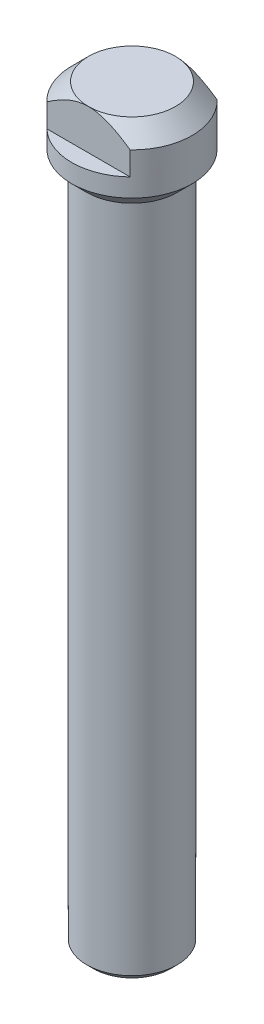
ISO-10303-21;
HEADER;
FILE_DESCRIPTION(('STEP AP214'),'2;1');
FILE_NAME('part.step','',(''),(''),'','','');
FILE_SCHEMA(('AUTOMOTIVE_DESIGN { 1 0 10303 214 1 1 1 1 }'));
ENDSEC;
DATA;
#1=APPLICATION_CONTEXT('core data for automotive mechanical design processes');
#2=APPLICATION_PROTOCOL_DEFINITION('international standard','automotive_design',2000,#1);
#3=PRODUCT_CONTEXT('',#1,'mechanical');
#4=PRODUCT('Part','Part','',(#3));
#5=PRODUCT_RELATED_PRODUCT_CATEGORY('part','',(#4));
#6=PRODUCT_DEFINITION_FORMATION('','',#4);
#7=PRODUCT_DEFINITION_CONTEXT('part definition',#1,'design');
#8=PRODUCT_DEFINITION('design','',#6,#7);
#9=PRODUCT_DEFINITION_SHAPE('','',#8);
#10=(LENGTH_UNIT() NAMED_UNIT(*) SI_UNIT(.MILLI.,.METRE.));
#11=(NAMED_UNIT(*) PLANE_ANGLE_UNIT() SI_UNIT($,.RADIAN.));
#12=(NAMED_UNIT(*) SI_UNIT($,.STERADIAN.) SOLID_ANGLE_UNIT());
#13=UNCERTAINTY_MEASURE_WITH_UNIT(LENGTH_MEASURE(1.E-05),#10,'distance_accuracy_value','');
#14=(GEOMETRIC_REPRESENTATION_CONTEXT(3) GLOBAL_UNCERTAINTY_ASSIGNED_CONTEXT((#13)) GLOBAL_UNIT_ASSIGNED_CONTEXT((#10,
#11,#12)) REPRESENTATION_CONTEXT('',''));
#15=CARTESIAN_POINT('',(0.,0.,0.));
#16=DIRECTION('',(0.,0.,1.));
#17=DIRECTION('',(1.,0.,0.));
#18=AXIS2_PLACEMENT_3D('',#15,#16,#17);
#19=CARTESIAN_POINT('',(0.,-224.,0.));
#20=DIRECTION('',(0.,1.,0.));
#21=DIRECTION('',(0.,0.,1.));
#22=AXIS2_PLACEMENT_3D('',#19,#20,#21);
#23=CYLINDRICAL_SURFACE('',#22,13.5);
#24=CARTESIAN_POINT('',(0.,-221.999999999999,0.));
#25=DIRECTION('',(0.,-1.,0.));
#26=DIRECTION('',(0.,0.,-1.));
#27=AXIS2_PLACEMENT_3D('',#24,#25,#26);
#28=CIRCLE('',#27,13.5);
#29=CARTESIAN_POINT('',(0.,-221.999999999999,-13.5));
#30=VERTEX_POINT('',#29);
#31=EDGE_CURVE('E41',#30,#30,#28,.F.);
#32=ORIENTED_EDGE('',*,*,#31,.T.);
#33=EDGE_LOOP('',(#32));
#34=FACE_BOUND('',#33,.T.);
#35=CARTESIAN_POINT('',(0.,-22.,0.));
#36=DIRECTION('',(0.,1.,0.));
#37=DIRECTION('',(0.,0.,1.));
#38=AXIS2_PLACEMENT_3D('',#35,#36,#37);
#39=CIRCLE('',#38,13.5);
#40=CARTESIAN_POINT('',(0.,-22.,13.5));
#41=VERTEX_POINT('',#40);
#42=EDGE_CURVE('E104',#41,#41,#39,.T.);
#43=ORIENTED_EDGE('',*,*,#42,.F.);
#44=EDGE_LOOP('',(#43));
#45=FACE_BOUND('',#44,.T.);
#46=ADVANCED_FACE('F33',(#34,#45),#23,.T.);
#47=CARTESIAN_POINT('',(13.5,-224.,0.));
#48=DIRECTION('',(0.,-1.,0.));
#49=DIRECTION('',(0.,0.,-1.));
#50=AXIS2_PLACEMENT_3D('',#47,#48,#49);
#51=PLANE('',#50);
#52=CARTESIAN_POINT('',(0.,-224.,0.));
#53=DIRECTION('',(0.,-1.,0.));
#54=DIRECTION('',(0.,0.,-1.));
#55=AXIS2_PLACEMENT_3D('',#52,#53,#54);
#56=CIRCLE('',#55,11.4999999999988);
#57=CARTESIAN_POINT('',(0.,-224.,-11.4999999999988));
#58=VERTEX_POINT('',#57);
#59=EDGE_CURVE('E11',#58,#58,#56,.T.);
#60=ORIENTED_EDGE('',*,*,#59,.T.);
#61=EDGE_LOOP('',(#60));
#62=FACE_BOUND('',#61,.T.);
#63=ADVANCED_FACE('F151',(#62),#51,.T.);
#64=CARTESIAN_POINT('',(0.,0.,0.));
#65=DIRECTION('',(0.,1.,0.));
#66=DIRECTION('',(0.,0.,1.));
#67=AXIS2_PLACEMENT_3D('',#64,#65,#66);
#68=PLANE('',#67);
#69=CARTESIAN_POINT('',(0.,0.,0.));
#70=DIRECTION('',(0.,1.,0.));
#71=DIRECTION('',(0.,0.,1.));
#72=AXIS2_PLACEMENT_3D('',#69,#70,#71);
#73=CIRCLE('',#72,13.);
#74=CARTESIAN_POINT('',(0.,0.,13.));
#75=VERTEX_POINT('',#74);
#76=CARTESIAN_POINT('',(0.,0.,-13.));
#77=VERTEX_POINT('',#76);
#78=EDGE_CURVE('E112',#75,#77,#73,.T.);
#79=ORIENTED_EDGE('',*,*,#78,.T.);
#80=CARTESIAN_POINT('',(0.,0.,0.));
#81=DIRECTION('',(0.,1.,0.));
#82=DIRECTION('',(0.,0.,1.));
#83=AXIS2_PLACEMENT_3D('',#80,#81,#82);
#84=CIRCLE('',#83,13.);
#85=EDGE_CURVE('E115',#77,#75,#84,.T.);
#86=ORIENTED_EDGE('',*,*,#85,.T.);
#87=EDGE_LOOP('',(#79,#86));
#88=FACE_BOUND('',#87,.T.);
#89=ADVANCED_FACE('F148',(#88),#68,.T.);
#90=CARTESIAN_POINT('',(0.,-224.,0.));
#91=DIRECTION('',(0.,1.,0.));
#92=DIRECTION('',(0.,0.,1.));
#93=AXIS2_PLACEMENT_3D('',#90,#91,#92);
#94=CYLINDRICAL_SURFACE('',#93,18.);
#95=DIRECTION('',(0.,1.,0.));
#96=VECTOR('',#95,1.);
#97=CARTESIAN_POINT('',(-12.4498995979887,-12.,13.));
#98=LINE('',#97,#96);
#99=CARTESIAN_POINT('',(-12.4498995979887,-12.,13.));
#100=VERTEX_POINT('',#99);
#101=CARTESIAN_POINT('',(-12.4498995979887,-5.00000000000003,13.));
#102=VERTEX_POINT('',#101);
#103=EDGE_CURVE('E102',#100,#102,#98,.T.);
#104=ORIENTED_EDGE('',*,*,#103,.T.);
#105=CARTESIAN_POINT('',(0.,-5.00000000000003,0.));
#106=DIRECTION('',(0.,1.,0.));
#107=DIRECTION('',(0.,0.,1.));
#108=AXIS2_PLACEMENT_3D('',#105,#106,#107);
#109=CIRCLE('',#108,18.);
#110=CARTESIAN_POINT('',(-12.4498995979887,-5.00000000000003,-13.));
#111=VERTEX_POINT('',#110);
#112=EDGE_CURVE('E48',#102,#111,#109,.F.);
#113=ORIENTED_EDGE('',*,*,#112,.T.);
#114=DIRECTION('',(0.,1.,0.));
#115=VECTOR('',#114,1.);
#116=CARTESIAN_POINT('',(-12.4498995979887,-12.,-13.));
#117=LINE('',#116,#115);
#118=CARTESIAN_POINT('',(-12.4498995979887,-12.,-13.));
#119=VERTEX_POINT('',#118);
#120=EDGE_CURVE('E88',#119,#111,#117,.T.);
#121=ORIENTED_EDGE('',*,*,#120,.F.);
#122=CARTESIAN_POINT('',(0.,-12.,0.));
#123=DIRECTION('',(0.,1.,0.));
#124=DIRECTION('',(0.,0.,1.));
#125=AXIS2_PLACEMENT_3D('',#122,#123,#124);
#126=CIRCLE('',#125,18.);
#127=CARTESIAN_POINT('',(12.4498995979887,-12.,-13.));
#128=VERTEX_POINT('',#127);
#129=EDGE_CURVE('E82',#128,#119,#126,.T.);
#130=ORIENTED_EDGE('',*,*,#129,.F.);
#131=DIRECTION('',(0.,1.,0.));
#132=VECTOR('',#131,1.);
#133=CARTESIAN_POINT('',(12.4498995979887,-12.,-13.));
#134=LINE('',#133,#132);
#135=CARTESIAN_POINT('',(12.4498995979887,-5.00000000000003,-13.));
#136=VERTEX_POINT('',#135);
#137=EDGE_CURVE('E90',#128,#136,#134,.T.);
#138=ORIENTED_EDGE('',*,*,#137,.T.);
#139=CARTESIAN_POINT('',(0.,-5.00000000000003,0.));
#140=DIRECTION('',(0.,1.,0.));
#141=DIRECTION('',(0.,0.,1.));
#142=AXIS2_PLACEMENT_3D('',#139,#140,#141);
#143=CIRCLE('',#142,18.);
#144=CARTESIAN_POINT('',(12.4498995979887,-5.00000000000003,13.));
#145=VERTEX_POINT('',#144);
#146=EDGE_CURVE('E262',#136,#145,#143,.F.);
#147=ORIENTED_EDGE('',*,*,#146,.T.);
#148=DIRECTION('',(0.,1.,0.));
#149=VECTOR('',#148,1.);
#150=CARTESIAN_POINT('',(12.4498995979887,-12.,13.));
#151=LINE('',#150,#149);
#152=CARTESIAN_POINT('',(12.4498995979887,-12.,13.));
#153=VERTEX_POINT('',#152);
#154=EDGE_CURVE('E101',#153,#145,#151,.T.);
#155=ORIENTED_EDGE('',*,*,#154,.F.);
#156=CARTESIAN_POINT('',(0.,-12.,0.));
#157=DIRECTION('',(0.,1.,0.));
#158=DIRECTION('',(0.,0.,1.));
#159=AXIS2_PLACEMENT_3D('',#156,#157,#158);
#160=CIRCLE('',#159,18.);
#161=EDGE_CURVE('E95',#100,#153,#160,.T.);
#162=ORIENTED_EDGE('',*,*,#161,.F.);
#163=EDGE_LOOP('',(#104,#113,#121,#130,#138,#147,#155,#162));
#164=FACE_BOUND('',#163,.T.);
#165=CARTESIAN_POINT('',(0.,-17.5,0.));
#166=DIRECTION('',(0.,1.,0.));
#167=DIRECTION('',(0.,0.,1.));
#168=AXIS2_PLACEMENT_3D('',#165,#166,#167);
#169=CIRCLE('',#168,18.);
#170=CARTESIAN_POINT('',(0.,-17.5,18.));
#171=VERTEX_POINT('',#170);
#172=EDGE_CURVE('E109',#171,#171,#169,.T.);
#173=ORIENTED_EDGE('',*,*,#172,.T.);
#174=EDGE_LOOP('',(#173));
#175=FACE_BOUND('',#174,.T.);
#176=ADVANCED_FACE('F92',(#164,#175),#94,.T.);
#177=CARTESIAN_POINT('',(0.,-17.5,0.));
#178=DIRECTION('',(0.,1.,0.));
#179=DIRECTION('',(0.,0.,1.));
#180=AXIS2_PLACEMENT_3D('',#177,#178,#179);
#181=CONICAL_SURFACE('',#180,18.,0.785398163397448);
#182=ORIENTED_EDGE('',*,*,#42,.T.);
#183=EDGE_LOOP('',(#182));
#184=FACE_BOUND('',#183,.T.);
#185=ORIENTED_EDGE('',*,*,#172,.F.);
#186=EDGE_LOOP('',(#185));
#187=FACE_BOUND('',#186,.T.);
#188=ADVANCED_FACE('F139',(#184,#187),#181,.T.);
#189=CARTESIAN_POINT('',(12.4498995979887,-12.,13.));
#190=DIRECTION('',(0.,0.,-1.));
#191=DIRECTION('',(-1.,0.,0.));
#192=AXIS2_PLACEMENT_3D('',#189,#190,#191);
#193=PLANE('',#192);
#194=CARTESIAN_POINT('',(12.4498995979887,-5.00000000000003,13.));
#195=CARTESIAN_POINT('',(12.2631843331497,-4.87086025848431,13.));
#196=CARTESIAN_POINT('',(12.0757646229241,-4.74274017590218,13.));
#197=CARTESIAN_POINT('',(11.6993931793425,-4.48875324290813,13.));
#198=CARTESIAN_POINT('',(11.5104413788478,-4.36288649202497,13.));
#199=CARTESIAN_POINT('',(10.9409010690305,-3.98885512534503,13.));
#200=CARTESIAN_POINT('',(10.5578505582246,-3.74441428425585,13.));
#201=CARTESIAN_POINT('',(9.77890209823614,-3.26442529985101,13.));
#202=CARTESIAN_POINT('',(9.38289991058264,-3.02904569083811,13.));
#203=CARTESIAN_POINT('',(8.58210710049563,-2.57382564793661,13.));
#204=CARTESIAN_POINT('',(8.17731818470746,-2.35398223113819,13.));
#205=CARTESIAN_POINT('',(7.37777805552297,-1.94388438927429,13.));
#206=CARTESIAN_POINT('',(6.98350202649208,-1.75270927771391,13.));
#207=CARTESIAN_POINT('',(6.1850141137399,-1.3919268898514,13.));
#208=CARTESIAN_POINT('',(5.78080024992307,-1.22232395401233,13.));
#209=CARTESIAN_POINT('',(4.96436910020615,-0.910551116510065,13.));
#210=CARTESIAN_POINT('',(4.55220774389935,-0.768236114679636,13.));
#211=CARTESIAN_POINT('',(3.7183416602801,-0.515495062311729,13.));
#212=CARTESIAN_POINT('',(3.29664400500093,-0.405046165697826,13.));
#213=CARTESIAN_POINT('',(2.63681748593436,-0.262746119060303,13.));
#214=CARTESIAN_POINT('',(2.40145304454405,-0.217889401399144,13.));
#215=CARTESIAN_POINT('',(1.92862411086484,-0.140213113134067,13.));
#216=CARTESIAN_POINT('',(1.69115879548199,-0.107398495671464,13.));
#217=CARTESIAN_POINT('',(1.21179299332119,-0.0541596099291939,13.));
#218=CARTESIAN_POINT('',(0.969874408503177,-0.0338973901596017,13.));
#219=CARTESIAN_POINT('',(0.485310135780531,-0.00679311744957215,13.));
#220=CARTESIAN_POINT('',(0.242664510940806,5.0067556726962E-05,13.));
#221=CARTESIAN_POINT('',(0.,0.,13.));
#222=B_SPLINE_CURVE_WITH_KNOTS('',3,(#194,#195,#196,#197,#198,#199,#200,#201,#202,#203,#204,
#205,#206,#207,#208,#209,#210,#211,#212,#213,#214,#215,#216,#217,#218,#219,#220,#221),
.UNSPECIFIED.,.F.,.F.,(4,2,2,2,2,2,2,2,2,2,2,2,2,4),(0.,0.681064126903537,1.36215826228191,
2.7251606159332,4.10690818953943,5.48838974624899,6.80240609891643,8.11668642344483,
9.42377166652893,10.729917466317,11.4484536441613,12.1672850390056,12.8952128869651,
13.6230793223313),.UNSPECIFIED.);
#223=EDGE_CURVE('E118',#145,#75,#222,.T.);
#224=ORIENTED_EDGE('',*,*,#223,.T.);
#225=CARTESIAN_POINT('',(0.,0.,13.));
#226=CARTESIAN_POINT('',(-0.199905804599923,2.3295326268405E-05,13.));
#227=CARTESIAN_POINT('',(-0.399803620348268,-0.00461042153148041,13.));
#228=CARTESIAN_POINT('',(-0.799146203503847,-0.0230187564449614,13.));
#229=CARTESIAN_POINT('',(-0.998591039888153,-0.0367918740036238,13.));
#230=CARTESIAN_POINT('',(-1.39627696875883,-0.0732711799259106,13.));
#231=CARTESIAN_POINT('',(-1.5945196313834,-0.0959602846718965,13.));
#232=CARTESIAN_POINT('',(-1.98982215575749,-0.149944272905635,13.));
#233=CARTESIAN_POINT('',(-2.18688197721353,-0.181239447878223,13.));
#234=CARTESIAN_POINT('',(-2.7689640843063,-0.286209713297041,13.));
#235=CARTESIAN_POINT('',(-3.15191181194736,-0.371643133707704,13.));
#236=CARTESIAN_POINT('',(-3.91046546904289,-0.57046466626372,13.));
#237=CARTESIAN_POINT('',(-4.28606899592123,-0.683861766592238,13.));
#238=CARTESIAN_POINT('',(-5.00185240767298,-0.925282138487751,13.));
#239=CARTESIAN_POINT('',(-5.34260710401606,-1.05161822659854,13.));
#240=CARTESIAN_POINT('',(-6.01716420220857,-1.32168620057333,13.));
#241=CARTESIAN_POINT('',(-6.35096550072545,-1.46542082287932,13.));
#242=CARTESIAN_POINT('',(-7.01251862803864,-1.76782579212045,13.));
#243=CARTESIAN_POINT('',(-7.34025666067862,-1.92652613766415,13.));
#244=CARTESIAN_POINT('',(-7.98941811265308,-2.25623266027683,13.));
#245=CARTESIAN_POINT('',(-8.31084204853872,-2.42723782531639,13.));
#246=CARTESIAN_POINT('',(-8.95935614768242,-2.78589490219893,13.));
#247=CARTESIAN_POINT('',(-9.28623713905815,-2.97392361905281,13.));
#248=CARTESIAN_POINT('',(-9.93448874993685,-3.35928382615128,13.));
#249=CARTESIAN_POINT('',(-10.2558588801478,-3.5566161366603,13.));
#250=CARTESIAN_POINT('',(-10.891861591784,-3.95794906010719,13.));
#251=CARTESIAN_POINT('',(-11.2065219328322,-4.16190583672125,13.));
#252=CARTESIAN_POINT('',(-11.8313919232672,-4.57633641176519,13.));
#253=CARTESIAN_POINT('',(-12.1416028667523,-4.78680825665059,13.));
#254=CARTESIAN_POINT('',(-12.4498995979887,-5.00000000000003,13.));
#255=B_SPLINE_CURVE_WITH_KNOTS('',3,(#225,#226,#227,#228,#229,#230,#231,#232,#233,#234,#235,
#236,#237,#238,#239,#240,#241,#242,#243,#244,#245,#246,#247,#248,#249,#250,#251,#252,#253,#254),
.UNSPECIFIED.,.F.,.F.,(4,2,2,2,2,2,2,2,2,2,2,2,2,2,4),(0.,0.599650467080227,1.19920250853592,
1.79761132677861,2.39604041543273,3.57180204420826,4.74794208408694,5.83765235336103,
6.92753423553819,8.01964919182454,9.11167442782385,10.2427987652926,11.3740230171099,
12.4988735196586,13.6233899419147),.UNSPECIFIED.);
#256=EDGE_CURVE('E125',#75,#102,#255,.T.);
#257=ORIENTED_EDGE('',*,*,#256,.T.);
#258=ORIENTED_EDGE('',*,*,#103,.F.);
#259=DIRECTION('',(-1.,0.,0.));
#260=VECTOR('',#259,1.);
#261=CARTESIAN_POINT('',(12.4498995979887,-12.,13.));
#262=LINE('',#261,#260);
#263=EDGE_CURVE('E99',#153,#100,#262,.T.);
#264=ORIENTED_EDGE('',*,*,#263,.F.);
#265=ORIENTED_EDGE('',*,*,#154,.T.);
#266=EDGE_LOOP('',(#224,#257,#258,#264,#265));
#267=FACE_BOUND('',#266,.T.);
#268=ADVANCED_FACE('F133',(#267),#193,.F.);
#269=CARTESIAN_POINT('',(0.,-12.,0.));
#270=DIRECTION('',(0.,1.,0.));
#271=DIRECTION('',(0.,0.,1.));
#272=AXIS2_PLACEMENT_3D('',#269,#270,#271);
#273=PLANE('',#272);
#274=ORIENTED_EDGE('',*,*,#161,.T.);
#275=ORIENTED_EDGE('',*,*,#263,.T.);
#276=EDGE_LOOP('',(#274,#275));
#277=FACE_BOUND('',#276,.T.);
#278=ADVANCED_FACE('F138',(#277),#273,.T.);
#279=CARTESIAN_POINT('',(-12.4498995979887,-12.,-13.));
#280=DIRECTION('',(0.,0.,1.));
#281=DIRECTION('',(1.,0.,0.));
#282=AXIS2_PLACEMENT_3D('',#279,#280,#281);
#283=PLANE('',#282);
#284=ORIENTED_EDGE('',*,*,#120,.T.);
#285=CARTESIAN_POINT('',(-12.4498995979887,-5.00000000000003,-13.));
#286=CARTESIAN_POINT('',(-12.2631843331497,-4.87086025848431,-13.));
#287=CARTESIAN_POINT('',(-12.0757646229241,-4.74274017590218,-13.));
#288=CARTESIAN_POINT('',(-11.6993931793425,-4.48875324290813,-13.));
#289=CARTESIAN_POINT('',(-11.5104413788478,-4.36288649202497,-13.));
#290=CARTESIAN_POINT('',(-10.9409010690305,-3.98885512534503,-13.));
#291=CARTESIAN_POINT('',(-10.5578505582246,-3.74441428425585,-13.));
#292=CARTESIAN_POINT('',(-9.77890209823614,-3.26442529985101,-13.));
#293=CARTESIAN_POINT('',(-9.38289991058263,-3.02904569083812,-13.));
#294=CARTESIAN_POINT('',(-8.58210710049562,-2.57382564793661,-13.));
#295=CARTESIAN_POINT('',(-8.17731818470746,-2.35398223113819,-13.));
#296=CARTESIAN_POINT('',(-7.37777805552297,-1.94388438927429,-13.));
#297=CARTESIAN_POINT('',(-6.98350202649207,-1.75270927771391,-13.));
#298=CARTESIAN_POINT('',(-6.1850141137399,-1.3919268898514,-13.));
#299=CARTESIAN_POINT('',(-5.78080024992307,-1.22232395401233,-13.));
#300=CARTESIAN_POINT('',(-4.96436910020615,-0.910551116510065,-13.));
#301=CARTESIAN_POINT('',(-4.55220774389935,-0.768236114679637,-13.));
#302=CARTESIAN_POINT('',(-3.7183416602801,-0.515495062311731,-13.));
#303=CARTESIAN_POINT('',(-3.29664400500093,-0.405046165697828,-13.));
#304=CARTESIAN_POINT('',(-2.63681748593435,-0.262746119060305,-13.));
#305=CARTESIAN_POINT('',(-2.40145304454405,-0.217889401399146,-13.));
#306=CARTESIAN_POINT('',(-1.92862411086484,-0.140213113134069,-13.));
#307=CARTESIAN_POINT('',(-1.69115879548199,-0.107398495671466,-13.));
#308=CARTESIAN_POINT('',(-1.21179299332119,-0.0541596099291956,-13.));
#309=CARTESIAN_POINT('',(-0.969874408503178,-0.0338973901596034,-13.));
#310=CARTESIAN_POINT('',(-0.485310135780532,-0.00679311744957382,-13.));
#311=CARTESIAN_POINT('',(-0.242664510940807,5.00675567252762E-05,-13.));
#312=CARTESIAN_POINT('',(0.,0.,-13.));
#313=B_SPLINE_CURVE_WITH_KNOTS('',3,(#285,#286,#287,#288,#289,#290,#291,#292,#293,#294,#295,
#296,#297,#298,#299,#300,#301,#302,#303,#304,#305,#306,#307,#308,#309,#310,#311,#312),
.UNSPECIFIED.,.F.,.F.,(4,2,2,2,2,2,2,2,2,2,2,2,2,4),(0.,0.681064126903539,1.36215826228191,
2.7251606159332,4.10690818953943,5.48838974624899,6.80240609891643,8.11668642344483,
9.42377166652893,10.729917466317,11.4484536441613,12.1672850390056,12.8952128869651,
13.6230793223313),.UNSPECIFIED.);
#314=EDGE_CURVE('E164',#111,#77,#313,.T.);
#315=ORIENTED_EDGE('',*,*,#314,.T.);
#316=CARTESIAN_POINT('',(0.,0.,-13.));
#317=CARTESIAN_POINT('',(0.199905804599923,2.32953262684965E-05,-13.));
#318=CARTESIAN_POINT('',(0.399803620348269,-0.00461042153148123,-13.));
#319=CARTESIAN_POINT('',(0.799146203503848,-0.0230187564449641,-13.));
#320=CARTESIAN_POINT('',(0.998591039888153,-0.0367918740036273,-13.));
#321=CARTESIAN_POINT('',(1.39627696875883,-0.0732711799259139,-13.));
#322=CARTESIAN_POINT('',(1.5945196313834,-0.0959602846718987,-13.));
#323=CARTESIAN_POINT('',(1.98982215575749,-0.149944272905636,-13.));
#324=CARTESIAN_POINT('',(2.18688197721354,-0.181239447878225,-13.));
#325=CARTESIAN_POINT('',(2.76896408430631,-0.286209713297043,-13.));
#326=CARTESIAN_POINT('',(3.15191181194737,-0.371643133707707,-13.));
#327=CARTESIAN_POINT('',(3.91046546904289,-0.570464666263724,-13.));
#328=CARTESIAN_POINT('',(4.28606899592123,-0.683861766592242,-13.));
#329=CARTESIAN_POINT('',(5.00185240767299,-0.925282138487754,-13.));
#330=CARTESIAN_POINT('',(5.34260710401606,-1.05161822659854,-13.));
#331=CARTESIAN_POINT('',(6.01716420220857,-1.32168620057334,-13.));
#332=CARTESIAN_POINT('',(6.35096550072545,-1.46542082287933,-13.));
#333=CARTESIAN_POINT('',(7.01251862803864,-1.76782579212046,-13.));
#334=CARTESIAN_POINT('',(7.34025666067862,-1.92652613766415,-13.));
#335=CARTESIAN_POINT('',(7.98941811265308,-2.25623266027683,-13.));
#336=CARTESIAN_POINT('',(8.31084204853872,-2.42723782531639,-13.));
#337=CARTESIAN_POINT('',(8.95935614768242,-2.78589490219893,-13.));
#338=CARTESIAN_POINT('',(9.28623713905816,-2.97392361905281,-13.));
#339=CARTESIAN_POINT('',(9.93448874993685,-3.35928382615128,-13.));
#340=CARTESIAN_POINT('',(10.2558588801478,-3.5566161366603,-13.));
#341=CARTESIAN_POINT('',(10.891861591784,-3.95794906010719,-13.));
#342=CARTESIAN_POINT('',(11.2065219328322,-4.16190583672125,-13.));
#343=CARTESIAN_POINT('',(11.8313919232672,-4.5763364117652,-13.));
#344=CARTESIAN_POINT('',(12.1416028667523,-4.78680825665059,-13.));
#345=CARTESIAN_POINT('',(12.4498995979887,-5.00000000000003,-13.));
#346=B_SPLINE_CURVE_WITH_KNOTS('',3,(#316,#317,#318,#319,#320,#321,#322,#323,#324,#325,#326,
#327,#328,#329,#330,#331,#332,#333,#334,#335,#336,#337,#338,#339,#340,#341,#342,#343,#344,#345),
.UNSPECIFIED.,.F.,.F.,(4,2,2,2,2,2,2,2,2,2,2,2,2,2,4),(0.,0.599650467080227,1.19920250853592,
1.79761132677861,2.39604041543274,3.57180204420826,4.74794208408695,5.83765235336103,
6.92753423553819,8.01964919182455,9.11167442782385,10.2427987652926,11.3740230171099,
12.4988735196586,13.6233899419147),.UNSPECIFIED.);
#347=EDGE_CURVE('E56',#77,#136,#346,.T.);
#348=ORIENTED_EDGE('',*,*,#347,.T.);
#349=ORIENTED_EDGE('',*,*,#137,.F.);
#350=DIRECTION('',(1.,0.,0.));
#351=VECTOR('',#350,1.);
#352=CARTESIAN_POINT('',(-12.4498995979887,-12.,-13.));
#353=LINE('',#352,#351);
#354=EDGE_CURVE('E85',#119,#128,#353,.T.);
#355=ORIENTED_EDGE('',*,*,#354,.F.);
#356=EDGE_LOOP('',(#284,#315,#348,#349,#355));
#357=FACE_BOUND('',#356,.T.);
#358=ADVANCED_FACE('F87',(#357),#283,.F.);
#359=CARTESIAN_POINT('',(0.,-12.,0.));
#360=DIRECTION('',(0.,1.,0.));
#361=DIRECTION('',(0.,0.,1.));
#362=AXIS2_PLACEMENT_3D('',#359,#360,#361);
#363=PLANE('',#362);
#364=ORIENTED_EDGE('',*,*,#129,.T.);
#365=ORIENTED_EDGE('',*,*,#354,.T.);
#366=EDGE_LOOP('',(#364,#365));
#367=FACE_BOUND('',#366,.T.);
#368=ADVANCED_FACE('F84',(#367),#363,.T.);
#369=CARTESIAN_POINT('',(0.,0.,0.));
#370=DIRECTION('',(0.,-1.,0.));
#371=DIRECTION('',(0.,0.,-1.));
#372=AXIS2_PLACEMENT_3D('',#369,#370,#371);
#373=CONICAL_SURFACE('',#372,13.,0.785398163397444);
#374=ORIENTED_EDGE('',*,*,#314,.F.);
#375=ORIENTED_EDGE('',*,*,#112,.F.);
#376=ORIENTED_EDGE('',*,*,#256,.F.);
#377=ORIENTED_EDGE('',*,*,#85,.F.);
#378=EDGE_LOOP('',(#374,#375,#376,#377));
#379=FACE_BOUND('',#378,.T.);
#380=ADVANCED_FACE('F158',(#379),#373,.T.);
#381=CARTESIAN_POINT('',(0.,0.,0.));
#382=DIRECTION('',(0.,-1.,0.));
#383=DIRECTION('',(0.,0.,-1.));
#384=AXIS2_PLACEMENT_3D('',#381,#382,#383);
#385=CONICAL_SURFACE('',#384,13.,0.785398163397444);
#386=ORIENTED_EDGE('',*,*,#223,.F.);
#387=ORIENTED_EDGE('',*,*,#146,.F.);
#388=ORIENTED_EDGE('',*,*,#347,.F.);
#389=ORIENTED_EDGE('',*,*,#78,.F.);
#390=EDGE_LOOP('',(#386,#387,#388,#389));
#391=FACE_BOUND('',#390,.T.);
#392=ADVANCED_FACE('F131',(#391),#385,.T.);
#393=CARTESIAN_POINT('',(0.,-221.999999999999,0.));
#394=DIRECTION('',(0.,1.,0.));
#395=DIRECTION('',(0.,0.,1.));
#396=AXIS2_PLACEMENT_3D('',#393,#394,#395);
#397=CONICAL_SURFACE('',#396,13.5,0.785398163397452);
#398=ORIENTED_EDGE('',*,*,#59,.F.);
#399=EDGE_LOOP('',(#398));
#400=FACE_BOUND('',#399,.T.);
#401=ORIENTED_EDGE('',*,*,#31,.F.);
#402=EDGE_LOOP('',(#401));
#403=FACE_BOUND('',#402,.T.);
#404=ADVANCED_FACE('F35',(#400,#403),#397,.T.);
#405=CLOSED_SHELL('',(#46,#63,#89,#176,#188,#268,#278,#358,#368,#380,#392,#404));
#406=MANIFOLD_SOLID_BREP('B2',#405);
#407=ADVANCED_BREP_SHAPE_REPRESENTATION('',(#18,#406),#14);
#408=SHAPE_DEFINITION_REPRESENTATION(#9,#407);
ENDSEC;
END-ISO-10303-21;
